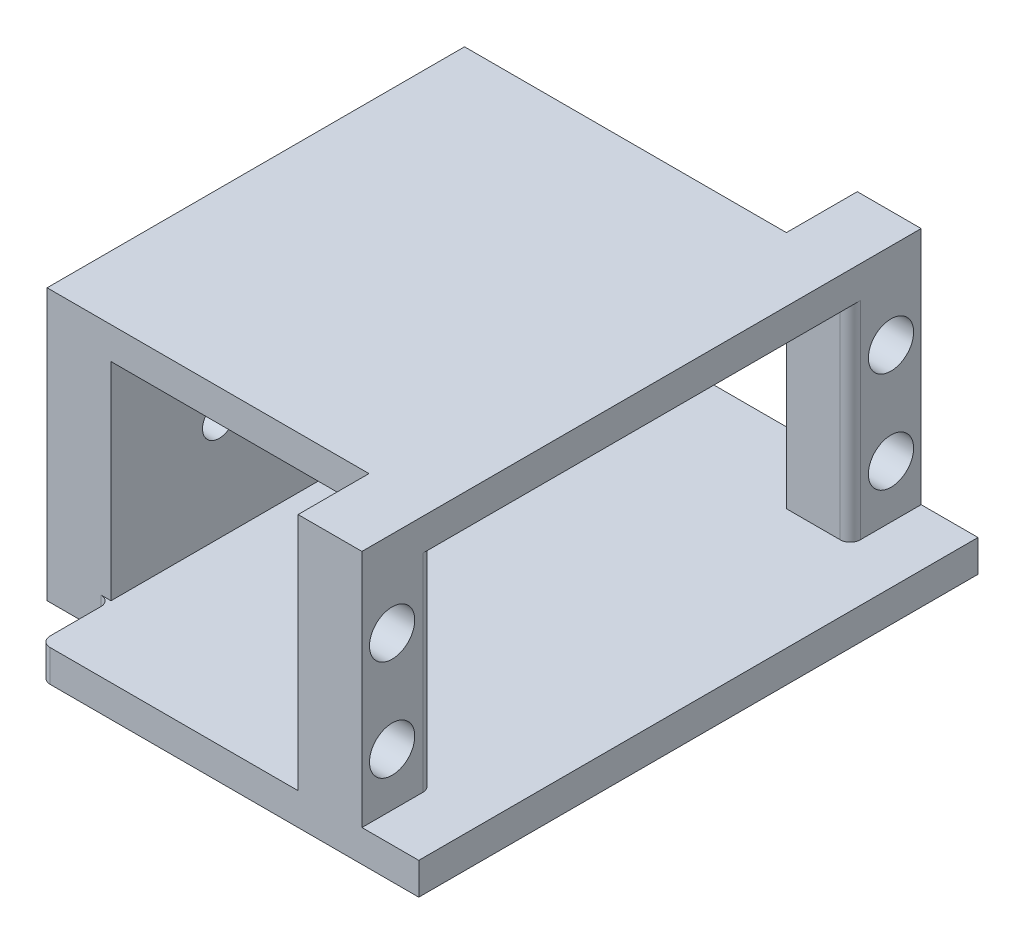
ISO-10303-21;
HEADER;
FILE_DESCRIPTION(('STEP AP214'),'2;1');
FILE_NAME('part.step','',(''),(''),'','','');
FILE_SCHEMA(('AUTOMOTIVE_DESIGN { 1 0 10303 214 1 1 1 1 }'));
ENDSEC;
DATA;
#1=APPLICATION_CONTEXT('core data for automotive mechanical design processes');
#2=APPLICATION_PROTOCOL_DEFINITION('international standard','automotive_design',2000,#1);
#3=PRODUCT_CONTEXT('',#1,'mechanical');
#4=PRODUCT('Part','Part','',(#3));
#5=PRODUCT_RELATED_PRODUCT_CATEGORY('part','',(#4));
#6=PRODUCT_DEFINITION_FORMATION('','',#4);
#7=PRODUCT_DEFINITION_CONTEXT('part definition',#1,'design');
#8=PRODUCT_DEFINITION('design','',#6,#7);
#9=PRODUCT_DEFINITION_SHAPE('','',#8);
#10=(LENGTH_UNIT() NAMED_UNIT(*) SI_UNIT(.MILLI.,.METRE.));
#11=(NAMED_UNIT(*) PLANE_ANGLE_UNIT() SI_UNIT($,.RADIAN.));
#12=(NAMED_UNIT(*) SI_UNIT($,.STERADIAN.) SOLID_ANGLE_UNIT());
#13=UNCERTAINTY_MEASURE_WITH_UNIT(LENGTH_MEASURE(1.E-05),#10,'distance_accuracy_value','');
#14=(GEOMETRIC_REPRESENTATION_CONTEXT(3) GLOBAL_UNCERTAINTY_ASSIGNED_CONTEXT((#13)) GLOBAL_UNIT_ASSIGNED_CONTEXT((#10,
#11,#12)) REPRESENTATION_CONTEXT('',''));
#15=CARTESIAN_POINT('',(0.,0.,0.));
#16=DIRECTION('',(0.,0.,1.));
#17=DIRECTION('',(1.,0.,0.));
#18=AXIS2_PLACEMENT_3D('',#15,#16,#17);
#19=CARTESIAN_POINT('',(0.,3.175,0.));
#20=DIRECTION('',(0.,1.,0.));
#21=DIRECTION('',(0.,0.,1.));
#22=AXIS2_PLACEMENT_3D('',#19,#20,#21);
#23=PLANE('',#22);
#24=DIRECTION('',(0.,0.,-1.));
#25=VECTOR('',#24,1.);
#26=CARTESIAN_POINT('',(-15.65,3.175,27.8));
#27=LINE('',#26,#25);
#28=CARTESIAN_POINT('',(-15.65,3.175,26.8));
#29=VERTEX_POINT('',#28);
#30=CARTESIAN_POINT('',(-15.65,3.175,21.7499999999998));
#31=VERTEX_POINT('',#30);
#32=EDGE_CURVE('E300',#29,#31,#27,.T.);
#33=ORIENTED_EDGE('',*,*,#32,.F.);
#34=CARTESIAN_POINT('',(-14.65,3.175,26.8));
#35=DIRECTION('',(0.,1.,0.));
#36=DIRECTION('',(0.,0.,1.));
#37=AXIS2_PLACEMENT_3D('',#34,#35,#36);
#38=CIRCLE('',#37,1.);
#39=CARTESIAN_POINT('',(-14.65,3.175,27.8));
#40=VERTEX_POINT('',#39);
#41=EDGE_CURVE('E272',#29,#40,#38,.T.);
#42=ORIENTED_EDGE('',*,*,#41,.T.);
#43=DIRECTION('',(1.,0.,0.));
#44=VECTOR('',#43,1.);
#45=CARTESIAN_POINT('',(-22.,3.175,27.8));
#46=LINE('',#45,#44);
#47=CARTESIAN_POINT('',(9.99999999999993,3.175,27.8));
#48=VERTEX_POINT('',#47);
#49=EDGE_CURVE('E242',#40,#48,#46,.T.);
#50=ORIENTED_EDGE('',*,*,#49,.T.);
#51=DIRECTION('',(0.,0.,1.));
#52=VECTOR('',#51,1.);
#53=CARTESIAN_POINT('',(9.99999999999993,3.175,27.8));
#54=LINE('',#53,#52);
#55=CARTESIAN_POINT('',(9.99999999999993,3.175,20.75));
#56=VERTEX_POINT('',#55);
#57=EDGE_CURVE('E454',#56,#48,#54,.T.);
#58=ORIENTED_EDGE('',*,*,#57,.F.);
#59=DIRECTION('',(-1.,0.,0.));
#60=VECTOR('',#59,1.);
#61=CARTESIAN_POINT('',(16.3499999999999,3.175,20.75));
#62=LINE('',#61,#60);
#63=CARTESIAN_POINT('',(15.3499999999999,3.175,20.75));
#64=VERTEX_POINT('',#63);
#65=EDGE_CURVE('E456',#64,#56,#62,.T.);
#66=ORIENTED_EDGE('',*,*,#65,.F.);
#67=CARTESIAN_POINT('',(15.3499999999999,3.175,21.75));
#68=DIRECTION('',(0.,1.,0.));
#69=DIRECTION('',(0.,0.,1.));
#70=AXIS2_PLACEMENT_3D('',#67,#68,#69);
#71=CIRCLE('',#70,1.);
#72=CARTESIAN_POINT('',(16.3499999999999,3.175,21.75));
#73=VERTEX_POINT('',#72);
#74=EDGE_CURVE('E261',#64,#73,#71,.F.);
#75=ORIENTED_EDGE('',*,*,#74,.T.);
#76=DIRECTION('',(0.,0.,-1.));
#77=VECTOR('',#76,1.);
#78=CARTESIAN_POINT('',(16.3499999999999,3.175,27.8));
#79=LINE('',#78,#77);
#80=CARTESIAN_POINT('',(16.3499999999999,3.175,27.8));
#81=VERTEX_POINT('',#80);
#82=EDGE_CURVE('E353',#81,#73,#79,.T.);
#83=ORIENTED_EDGE('',*,*,#82,.F.);
#84=CARTESIAN_POINT('',(22.,3.175,27.8));
#85=VERTEX_POINT('',#84);
#86=EDGE_CURVE('E333',#81,#85,#46,.T.);
#87=ORIENTED_EDGE('',*,*,#86,.T.);
#88=DIRECTION('',(0.,0.,-1.));
#89=VECTOR('',#88,1.);
#90=CARTESIAN_POINT('',(22.,3.175,-27.8));
#91=LINE('',#90,#89);
#92=CARTESIAN_POINT('',(22.,3.175,-27.8));
#93=VERTEX_POINT('',#92);
#94=EDGE_CURVE('E232',#85,#93,#91,.T.);
#95=ORIENTED_EDGE('',*,*,#94,.T.);
#96=DIRECTION('',(-1.,0.,0.));
#97=VECTOR('',#96,1.);
#98=CARTESIAN_POINT('',(-22.,3.175,-27.8));
#99=LINE('',#98,#97);
#100=CARTESIAN_POINT('',(16.3499999999999,3.175,-27.8));
#101=VERTEX_POINT('',#100);
#102=EDGE_CURVE('E330',#93,#101,#99,.T.);
#103=ORIENTED_EDGE('',*,*,#102,.T.);
#104=DIRECTION('',(0.,0.,-1.));
#105=VECTOR('',#104,1.);
#106=CARTESIAN_POINT('',(16.3499999999999,3.175,-27.8000000000005));
#107=LINE('',#106,#105);
#108=CARTESIAN_POINT('',(16.3499999999999,3.175,-21.7500000000005));
#109=VERTEX_POINT('',#108);
#110=EDGE_CURVE('E437',#109,#101,#107,.T.);
#111=ORIENTED_EDGE('',*,*,#110,.F.);
#112=CARTESIAN_POINT('',(15.3499999999999,3.175,-21.7500000000005));
#113=DIRECTION('',(0.,1.,0.));
#114=DIRECTION('',(0.,0.,1.));
#115=AXIS2_PLACEMENT_3D('',#112,#113,#114);
#116=CIRCLE('',#115,1.);
#117=CARTESIAN_POINT('',(15.3499999999999,3.175,-20.7500000000005));
#118=VERTEX_POINT('',#117);
#119=EDGE_CURVE('E256',#109,#118,#116,.F.);
#120=ORIENTED_EDGE('',*,*,#119,.T.);
#121=DIRECTION('',(1.,0.,0.));
#122=VECTOR('',#121,1.);
#123=CARTESIAN_POINT('',(16.3499999999999,3.175,-20.7500000000005));
#124=LINE('',#123,#122);
#125=CARTESIAN_POINT('',(9.99999999999991,3.175,-20.7500000000005));
#126=VERTEX_POINT('',#125);
#127=EDGE_CURVE('E440',#126,#118,#124,.T.);
#128=ORIENTED_EDGE('',*,*,#127,.F.);
#129=DIRECTION('',(0.,0.,1.));
#130=VECTOR('',#129,1.);
#131=CARTESIAN_POINT('',(9.99999999999991,3.175,-27.8000000000005));
#132=LINE('',#131,#130);
#133=CARTESIAN_POINT('',(9.99999999999991,3.175,-27.8000000000005));
#134=VERTEX_POINT('',#133);
#135=EDGE_CURVE('E433',#134,#126,#132,.T.);
#136=ORIENTED_EDGE('',*,*,#135,.F.);
#137=CARTESIAN_POINT('',(-14.65,3.175,-27.8));
#138=VERTEX_POINT('',#137);
#139=EDGE_CURVE('E329',#134,#138,#99,.T.);
#140=ORIENTED_EDGE('',*,*,#139,.T.);
#141=CARTESIAN_POINT('',(-14.65,3.175,-26.8));
#142=DIRECTION('',(0.,1.,0.));
#143=DIRECTION('',(0.,0.,1.));
#144=AXIS2_PLACEMENT_3D('',#141,#142,#143);
#145=CIRCLE('',#144,1.);
#146=CARTESIAN_POINT('',(-15.65,3.175,-26.8));
#147=VERTEX_POINT('',#146);
#148=EDGE_CURVE('E270',#138,#147,#145,.T.);
#149=ORIENTED_EDGE('',*,*,#148,.T.);
#150=DIRECTION('',(0.,0.,-1.));
#151=VECTOR('',#150,1.);
#152=CARTESIAN_POINT('',(-15.65,3.175,-27.8));
#153=LINE('',#152,#151);
#154=CARTESIAN_POINT('',(-15.65,3.175,-21.7500000000003));
#155=VERTEX_POINT('',#154);
#156=EDGE_CURVE('E367',#155,#147,#153,.T.);
#157=ORIENTED_EDGE('',*,*,#156,.F.);
#158=CARTESIAN_POINT('',(-16.65,3.175,-21.7500000000003));
#159=DIRECTION('',(0.,1.,0.));
#160=DIRECTION('',(0.,0.,1.));
#161=AXIS2_PLACEMENT_3D('',#158,#159,#160);
#162=CIRCLE('',#161,1.);
#163=CARTESIAN_POINT('',(-16.65,3.175,-20.7500000000003));
#164=VERTEX_POINT('',#163);
#165=EDGE_CURVE('E43',#155,#164,#162,.F.);
#166=ORIENTED_EDGE('',*,*,#165,.T.);
#167=DIRECTION('',(-1.,0.,0.));
#168=VECTOR('',#167,1.);
#169=CARTESIAN_POINT('',(-15.65,3.175,-20.7500000000003));
#170=LINE('',#169,#168);
#171=CARTESIAN_POINT('',(-15.65,3.175,-20.7500000000003));
#172=VERTEX_POINT('',#171);
#173=EDGE_CURVE('E50',#172,#164,#170,.T.);
#174=ORIENTED_EDGE('',*,*,#173,.F.);
#175=DIRECTION('',(0.,0.,-1.));
#176=VECTOR('',#175,1.);
#177=CARTESIAN_POINT('',(-15.65,3.175,-20.7500000000003));
#178=LINE('',#177,#176);
#179=CARTESIAN_POINT('',(-15.65,3.175,20.7499999999998));
#180=VERTEX_POINT('',#179);
#181=EDGE_CURVE('E314',#180,#172,#178,.T.);
#182=ORIENTED_EDGE('',*,*,#181,.F.);
#183=DIRECTION('',(1.,0.,0.));
#184=VECTOR('',#183,1.);
#185=CARTESIAN_POINT('',(-15.65,3.175,20.7499999999998));
#186=LINE('',#185,#184);
#187=CARTESIAN_POINT('',(-16.65,3.175,20.7499999999998));
#188=VERTEX_POINT('',#187);
#189=EDGE_CURVE('E280',#188,#180,#186,.T.);
#190=ORIENTED_EDGE('',*,*,#189,.F.);
#191=CARTESIAN_POINT('',(-16.65,3.175,21.7499999999998));
#192=DIRECTION('',(0.,1.,0.));
#193=DIRECTION('',(0.,0.,1.));
#194=AXIS2_PLACEMENT_3D('',#191,#192,#193);
#195=CIRCLE('',#194,1.);
#196=EDGE_CURVE('E295',#188,#31,#195,.F.);
#197=ORIENTED_EDGE('',*,*,#196,.T.);
#198=EDGE_LOOP('',(#33,#42,#50,#58,#66,#75,#83,#87,#95,#103,#111,#120,#128,#136,#140,#149,#157,
#166,#174,#182,#190,#197));
#199=FACE_BOUND('',#198,.T.);
#200=ADVANCED_FACE('F35',(#199),#23,.T.);
#201=CARTESIAN_POINT('',(22.,3.175,-27.8));
#202=DIRECTION('',(-1.,0.,0.));
#203=DIRECTION('',(0.,0.,1.));
#204=AXIS2_PLACEMENT_3D('',#201,#202,#203);
#205=PLANE('',#204);
#206=DIRECTION('',(0.,0.,-1.));
#207=VECTOR('',#206,1.);
#208=CARTESIAN_POINT('',(22.,0.,-27.8));
#209=LINE('',#208,#207);
#210=CARTESIAN_POINT('',(22.,0.,27.8));
#211=VERTEX_POINT('',#210);
#212=CARTESIAN_POINT('',(22.,0.,-27.8));
#213=VERTEX_POINT('',#212);
#214=EDGE_CURVE('E211',#211,#213,#209,.T.);
#215=ORIENTED_EDGE('',*,*,#214,.T.);
#216=DIRECTION('',(0.,-1.,0.));
#217=VECTOR('',#216,1.);
#218=CARTESIAN_POINT('',(22.,3.175,-27.8));
#219=LINE('',#218,#217);
#220=EDGE_CURVE('E241',#93,#213,#219,.T.);
#221=ORIENTED_EDGE('',*,*,#220,.F.);
#222=ORIENTED_EDGE('',*,*,#94,.F.);
#223=DIRECTION('',(0.,-1.,0.));
#224=VECTOR('',#223,1.);
#225=CARTESIAN_POINT('',(22.,3.175,27.8));
#226=LINE('',#225,#224);
#227=EDGE_CURVE('E238',#85,#211,#226,.T.);
#228=ORIENTED_EDGE('',*,*,#227,.T.);
#229=EDGE_LOOP('',(#215,#221,#222,#228));
#230=FACE_BOUND('',#229,.T.);
#231=ADVANCED_FACE('F338',(#230),#205,.F.);
#232=CARTESIAN_POINT('',(-22.,3.175,-27.8));
#233=DIRECTION('',(0.,0.,1.));
#234=DIRECTION('',(1.,0.,0.));
#235=AXIS2_PLACEMENT_3D('',#232,#233,#234);
#236=PLANE('',#235);
#237=DIRECTION('',(-1.,0.,0.));
#238=VECTOR('',#237,1.);
#239=CARTESIAN_POINT('',(-22.,0.,-27.8));
#240=LINE('',#239,#238);
#241=CARTESIAN_POINT('',(-14.65,0.,-27.8));
#242=VERTEX_POINT('',#241);
#243=EDGE_CURVE('E230',#213,#242,#240,.T.);
#244=ORIENTED_EDGE('',*,*,#243,.T.);
#245=DIRECTION('',(0.,1.,0.));
#246=VECTOR('',#245,1.);
#247=CARTESIAN_POINT('',(-14.65,3.175,-27.8));
#248=LINE('',#247,#246);
#249=EDGE_CURVE('E292',#242,#138,#248,.T.);
#250=ORIENTED_EDGE('',*,*,#249,.T.);
#251=ORIENTED_EDGE('',*,*,#139,.F.);
#252=DIRECTION('',(0.,-1.,0.));
#253=VECTOR('',#252,1.);
#254=CARTESIAN_POINT('',(9.99999999999991,23.775,-27.8000000000005));
#255=LINE('',#254,#253);
#256=CARTESIAN_POINT('',(9.99999999999991,26.95,-27.8000000000005));
#257=VERTEX_POINT('',#256);
#258=EDGE_CURVE('E448',#257,#134,#255,.T.);
#259=ORIENTED_EDGE('',*,*,#258,.F.);
#260=DIRECTION('',(-1.,0.,0.));
#261=VECTOR('',#260,1.);
#262=CARTESIAN_POINT('',(9.99999999999991,26.95,-27.8000000000005));
#263=LINE('',#262,#261);
#264=CARTESIAN_POINT('',(16.3499999999999,26.95,-27.8000000000005));
#265=VERTEX_POINT('',#264);
#266=EDGE_CURVE('E414',#265,#257,#263,.T.);
#267=ORIENTED_EDGE('',*,*,#266,.F.);
#268=DIRECTION('',(0.,-1.,0.));
#269=VECTOR('',#268,1.);
#270=CARTESIAN_POINT('',(16.3499999999999,23.775,-27.8000000000005));
#271=LINE('',#270,#269);
#272=EDGE_CURVE('E349',#265,#101,#271,.T.);
#273=ORIENTED_EDGE('',*,*,#272,.T.);
#274=ORIENTED_EDGE('',*,*,#102,.F.);
#275=ORIENTED_EDGE('',*,*,#220,.T.);
#276=EDGE_LOOP('',(#244,#250,#251,#259,#267,#273,#274,#275));
#277=FACE_BOUND('',#276,.T.);
#278=ADVANCED_FACE('F346',(#277),#236,.F.);
#279=CARTESIAN_POINT('',(-22.,3.175,-27.8));
#280=DIRECTION('',(1.,0.,0.));
#281=DIRECTION('',(0.,0.,-1.));
#282=AXIS2_PLACEMENT_3D('',#279,#280,#281);
#283=PLANE('',#282);
#284=CARTESIAN_POINT('',(-22.,13.43,9.99999999999983));
#285=DIRECTION('',(-1.,0.,0.));
#286=DIRECTION('',(0.,0.,1.));
#287=AXIS2_PLACEMENT_3D('',#284,#285,#286);
#288=CIRCLE('',#287,1.65);
#289=CARTESIAN_POINT('',(-22.,13.43,11.6499999999998));
#290=VERTEX_POINT('',#289);
#291=EDGE_CURVE('E223',#290,#290,#288,.T.);
#292=ORIENTED_EDGE('',*,*,#291,.F.);
#293=EDGE_LOOP('',(#292));
#294=FACE_BOUND('',#293,.T.);
#295=DIRECTION('',(0.,0.,1.));
#296=VECTOR('',#295,1.);
#297=CARTESIAN_POINT('',(-22.,0.,-27.8));
#298=LINE('',#297,#296);
#299=CARTESIAN_POINT('',(-22.,0.,-20.7500000000003));
#300=VERTEX_POINT('',#299);
#301=CARTESIAN_POINT('',(-22.,0.,20.7499999999998));
#302=VERTEX_POINT('',#301);
#303=EDGE_CURVE('E219',#300,#302,#298,.T.);
#304=ORIENTED_EDGE('',*,*,#303,.T.);
#305=DIRECTION('',(0.,-1.,0.));
#306=VECTOR('',#305,1.);
#307=CARTESIAN_POINT('',(-22.,23.775,20.7499999999998));
#308=LINE('',#307,#306);
#309=CARTESIAN_POINT('',(-22.,26.95,20.7499999999998));
#310=VERTEX_POINT('',#309);
#311=EDGE_CURVE('E199',#310,#302,#308,.T.);
#312=ORIENTED_EDGE('',*,*,#311,.F.);
#313=DIRECTION('',(0.,0.,1.));
#314=VECTOR('',#313,1.);
#315=CARTESIAN_POINT('',(-22.,26.95,20.7499999999998));
#316=LINE('',#315,#314);
#317=CARTESIAN_POINT('',(-22.,26.95,-20.7500000000003));
#318=VERTEX_POINT('',#317);
#319=EDGE_CURVE('E401',#318,#310,#316,.T.);
#320=ORIENTED_EDGE('',*,*,#319,.F.);
#321=DIRECTION('',(0.,-1.,0.));
#322=VECTOR('',#321,1.);
#323=CARTESIAN_POINT('',(-22.,23.775,-20.7500000000003));
#324=LINE('',#323,#322);
#325=EDGE_CURVE('E228',#318,#300,#324,.T.);
#326=ORIENTED_EDGE('',*,*,#325,.T.);
#327=EDGE_LOOP('',(#304,#312,#320,#326));
#328=FACE_BOUND('',#327,.T.);
#329=ADVANCED_FACE('F227',(#294,#328),#283,.F.);
#330=CARTESIAN_POINT('',(-22.,3.175,27.8));
#331=DIRECTION('',(0.,0.,-1.));
#332=DIRECTION('',(-1.,0.,0.));
#333=AXIS2_PLACEMENT_3D('',#330,#331,#332);
#334=PLANE('',#333);
#335=ORIENTED_EDGE('',*,*,#49,.F.);
#336=DIRECTION('',(0.,1.,0.));
#337=VECTOR('',#336,1.);
#338=CARTESIAN_POINT('',(-14.65,3.175,27.8));
#339=LINE('',#338,#337);
#340=CARTESIAN_POINT('',(-14.65,0.,27.8));
#341=VERTEX_POINT('',#340);
#342=EDGE_CURVE('E274',#40,#341,#339,.F.);
#343=ORIENTED_EDGE('',*,*,#342,.T.);
#344=DIRECTION('',(1.,0.,0.));
#345=VECTOR('',#344,1.);
#346=CARTESIAN_POINT('',(-22.,0.,27.8));
#347=LINE('',#346,#345);
#348=EDGE_CURVE('E229',#341,#211,#347,.T.);
#349=ORIENTED_EDGE('',*,*,#348,.T.);
#350=ORIENTED_EDGE('',*,*,#227,.F.);
#351=ORIENTED_EDGE('',*,*,#86,.F.);
#352=DIRECTION('',(0.,-1.,0.));
#353=VECTOR('',#352,1.);
#354=CARTESIAN_POINT('',(16.3499999999999,23.775,27.8));
#355=LINE('',#354,#353);
#356=CARTESIAN_POINT('',(16.3499999999999,26.95,27.8));
#357=VERTEX_POINT('',#356);
#358=EDGE_CURVE('E453',#357,#81,#355,.T.);
#359=ORIENTED_EDGE('',*,*,#358,.F.);
#360=DIRECTION('',(1.,0.,0.));
#361=VECTOR('',#360,1.);
#362=CARTESIAN_POINT('',(16.3499999999999,26.95,27.8));
#363=LINE('',#362,#361);
#364=CARTESIAN_POINT('',(9.99999999999993,26.95,27.8));
#365=VERTEX_POINT('',#364);
#366=EDGE_CURVE('E408',#365,#357,#363,.T.);
#367=ORIENTED_EDGE('',*,*,#366,.F.);
#368=DIRECTION('',(0.,-1.,0.));
#369=VECTOR('',#368,1.);
#370=CARTESIAN_POINT('',(9.99999999999993,23.775,27.8));
#371=LINE('',#370,#369);
#372=EDGE_CURVE('E461',#365,#48,#371,.T.);
#373=ORIENTED_EDGE('',*,*,#372,.T.);
#374=EDGE_LOOP('',(#335,#343,#349,#350,#351,#359,#367,#373));
#375=FACE_BOUND('',#374,.T.);
#376=ADVANCED_FACE('F357',(#375),#334,.F.);
#377=CARTESIAN_POINT('',(0.,0.,0.));
#378=DIRECTION('',(0.,1.,0.));
#379=DIRECTION('',(0.,0.,1.));
#380=AXIS2_PLACEMENT_3D('',#377,#378,#379);
#381=PLANE('',#380);
#382=ORIENTED_EDGE('',*,*,#348,.F.);
#383=CARTESIAN_POINT('',(-14.65,0.,26.8));
#384=DIRECTION('',(0.,1.,0.));
#385=DIRECTION('',(0.,0.,1.));
#386=AXIS2_PLACEMENT_3D('',#383,#384,#385);
#387=CIRCLE('',#386,1.);
#388=CARTESIAN_POINT('',(-15.65,0.,26.8));
#389=VERTEX_POINT('',#388);
#390=EDGE_CURVE('E278',#341,#389,#387,.F.);
#391=ORIENTED_EDGE('',*,*,#390,.T.);
#392=DIRECTION('',(0.,0.,1.));
#393=VECTOR('',#392,1.);
#394=CARTESIAN_POINT('',(-15.65,0.,27.8));
#395=LINE('',#394,#393);
#396=CARTESIAN_POINT('',(-15.65,0.,21.7499999999998));
#397=VERTEX_POINT('',#396);
#398=EDGE_CURVE('E224',#397,#389,#395,.T.);
#399=ORIENTED_EDGE('',*,*,#398,.F.);
#400=CARTESIAN_POINT('',(-16.65,0.,21.7499999999998));
#401=DIRECTION('',(0.,1.,0.));
#402=DIRECTION('',(0.,0.,1.));
#403=AXIS2_PLACEMENT_3D('',#400,#401,#402);
#404=CIRCLE('',#403,1.);
#405=CARTESIAN_POINT('',(-16.65,0.,20.7499999999998));
#406=VERTEX_POINT('',#405);
#407=EDGE_CURVE('E222',#397,#406,#404,.T.);
#408=ORIENTED_EDGE('',*,*,#407,.T.);
#409=DIRECTION('',(1.,0.,0.));
#410=VECTOR('',#409,1.);
#411=CARTESIAN_POINT('',(-22.,0.,20.7499999999998));
#412=LINE('',#411,#410);
#413=EDGE_CURVE('E203',#302,#406,#412,.T.);
#414=ORIENTED_EDGE('',*,*,#413,.F.);
#415=ORIENTED_EDGE('',*,*,#303,.F.);
#416=DIRECTION('',(-1.,0.,0.));
#417=VECTOR('',#416,1.);
#418=CARTESIAN_POINT('',(-22.,0.,-20.7500000000003));
#419=LINE('',#418,#417);
#420=CARTESIAN_POINT('',(-16.65,0.,-20.7500000000003));
#421=VERTEX_POINT('',#420);
#422=EDGE_CURVE('E307',#421,#300,#419,.T.);
#423=ORIENTED_EDGE('',*,*,#422,.F.);
#424=CARTESIAN_POINT('',(-16.65,0.,-21.7500000000003));
#425=DIRECTION('',(0.,1.,0.));
#426=DIRECTION('',(0.,0.,1.));
#427=AXIS2_PLACEMENT_3D('',#424,#425,#426);
#428=CIRCLE('',#427,1.);
#429=CARTESIAN_POINT('',(-15.65,0.,-21.7500000000003));
#430=VERTEX_POINT('',#429);
#431=EDGE_CURVE('E11',#421,#430,#428,.T.);
#432=ORIENTED_EDGE('',*,*,#431,.T.);
#433=DIRECTION('',(0.,0.,1.));
#434=VECTOR('',#433,1.);
#435=CARTESIAN_POINT('',(-15.65,0.,-27.8));
#436=LINE('',#435,#434);
#437=CARTESIAN_POINT('',(-15.65,0.,-26.8));
#438=VERTEX_POINT('',#437);
#439=EDGE_CURVE('E364',#438,#430,#436,.T.);
#440=ORIENTED_EDGE('',*,*,#439,.F.);
#441=CARTESIAN_POINT('',(-14.65,0.,-26.8));
#442=DIRECTION('',(0.,1.,0.));
#443=DIRECTION('',(0.,0.,1.));
#444=AXIS2_PLACEMENT_3D('',#441,#442,#443);
#445=CIRCLE('',#444,1.);
#446=EDGE_CURVE('E276',#438,#242,#445,.F.);
#447=ORIENTED_EDGE('',*,*,#446,.T.);
#448=ORIENTED_EDGE('',*,*,#243,.F.);
#449=ORIENTED_EDGE('',*,*,#214,.F.);
#450=EDGE_LOOP('',(#382,#391,#399,#408,#414,#415,#423,#432,#440,#447,#448,#449));
#451=FACE_BOUND('',#450,.T.);
#452=ADVANCED_FACE('F217',(#451),#381,.F.);
#453=CARTESIAN_POINT('',(-15.65,23.775,20.7499999999998));
#454=DIRECTION('',(0.,0.,-1.));
#455=DIRECTION('',(-1.,0.,0.));
#456=AXIS2_PLACEMENT_3D('',#453,#454,#455);
#457=PLANE('',#456);
#458=ORIENTED_EDGE('',*,*,#413,.T.);
#459=DIRECTION('',(0.,1.,0.));
#460=VECTOR('',#459,1.);
#461=CARTESIAN_POINT('',(-16.65,3.175,20.7499999999998));
#462=LINE('',#461,#460);
#463=EDGE_CURVE('E282',#406,#188,#462,.T.);
#464=ORIENTED_EDGE('',*,*,#463,.T.);
#465=ORIENTED_EDGE('',*,*,#189,.T.);
#466=DIRECTION('',(0.,-1.,0.));
#467=VECTOR('',#466,1.);
#468=CARTESIAN_POINT('',(-15.65,23.775,20.7499999999998));
#469=LINE('',#468,#467);
#470=CARTESIAN_POINT('',(-15.65,23.775,20.7499999999998));
#471=VERTEX_POINT('',#470);
#472=EDGE_CURVE('E212',#471,#180,#469,.T.);
#473=ORIENTED_EDGE('',*,*,#472,.F.);
#474=DIRECTION('',(1.,0.,0.));
#475=VECTOR('',#474,1.);
#476=CARTESIAN_POINT('',(9.99999999999993,23.775,20.75));
#477=LINE('',#476,#475);
#478=CARTESIAN_POINT('',(9.99999999999993,23.775,20.75));
#479=VERTEX_POINT('',#478);
#480=EDGE_CURVE('E400',#471,#479,#477,.T.);
#481=ORIENTED_EDGE('',*,*,#480,.T.);
#482=DIRECTION('',(0.,-1.,0.));
#483=VECTOR('',#482,1.);
#484=CARTESIAN_POINT('',(9.99999999999993,26.95,20.75));
#485=LINE('',#484,#483);
#486=CARTESIAN_POINT('',(9.99999999999993,26.95,20.75));
#487=VERTEX_POINT('',#486);
#488=EDGE_CURVE('E430',#487,#479,#485,.T.);
#489=ORIENTED_EDGE('',*,*,#488,.F.);
#490=DIRECTION('',(1.,0.,0.));
#491=VECTOR('',#490,1.);
#492=CARTESIAN_POINT('',(9.99999999999993,26.95,20.75));
#493=LINE('',#492,#491);
#494=EDGE_CURVE('E206',#310,#487,#493,.T.);
#495=ORIENTED_EDGE('',*,*,#494,.F.);
#496=ORIENTED_EDGE('',*,*,#311,.T.);
#497=EDGE_LOOP('',(#458,#464,#465,#473,#481,#489,#495,#496));
#498=FACE_BOUND('',#497,.T.);
#499=ADVANCED_FACE('F201',(#498),#457,.F.);
#500=CARTESIAN_POINT('',(-15.65,23.775,-20.7500000000003));
#501=DIRECTION('',(-1.,0.,0.));
#502=DIRECTION('',(0.,0.,1.));
#503=AXIS2_PLACEMENT_3D('',#500,#501,#502);
#504=PLANE('',#503);
#505=CARTESIAN_POINT('',(-15.65,13.43,9.99999999999983));
#506=DIRECTION('',(-1.,0.,0.));
#507=DIRECTION('',(0.,0.,1.));
#508=AXIS2_PLACEMENT_3D('',#505,#506,#507);
#509=CIRCLE('',#508,1.65);
#510=CARTESIAN_POINT('',(-15.65,13.43,11.6499999999998));
#511=VERTEX_POINT('',#510);
#512=EDGE_CURVE('E373',#511,#511,#509,.F.);
#513=ORIENTED_EDGE('',*,*,#512,.F.);
#514=EDGE_LOOP('',(#513));
#515=FACE_BOUND('',#514,.T.);
#516=ORIENTED_EDGE('',*,*,#181,.T.);
#517=DIRECTION('',(0.,-1.,0.));
#518=VECTOR('',#517,1.);
#519=CARTESIAN_POINT('',(-15.65,23.775,-20.7500000000003));
#520=LINE('',#519,#518);
#521=CARTESIAN_POINT('',(-15.65,23.775,-20.7500000000003));
#522=VERTEX_POINT('',#521);
#523=EDGE_CURVE('E322',#522,#172,#520,.T.);
#524=ORIENTED_EDGE('',*,*,#523,.F.);
#525=DIRECTION('',(0.,0.,-1.));
#526=VECTOR('',#525,1.);
#527=CARTESIAN_POINT('',(-15.65,23.775,-20.7500000000003));
#528=LINE('',#527,#526);
#529=EDGE_CURVE('E316',#471,#522,#528,.T.);
#530=ORIENTED_EDGE('',*,*,#529,.F.);
#531=ORIENTED_EDGE('',*,*,#472,.T.);
#532=EDGE_LOOP('',(#516,#524,#530,#531));
#533=FACE_BOUND('',#532,.T.);
#534=ADVANCED_FACE('F319',(#515,#533),#504,.F.);
#535=CARTESIAN_POINT('',(-15.65,23.775,-20.7500000000003));
#536=DIRECTION('',(0.,0.,1.));
#537=DIRECTION('',(1.,0.,0.));
#538=AXIS2_PLACEMENT_3D('',#535,#536,#537);
#539=PLANE('',#538);
#540=ORIENTED_EDGE('',*,*,#523,.T.);
#541=ORIENTED_EDGE('',*,*,#173,.T.);
#542=DIRECTION('',(0.,1.,0.));
#543=VECTOR('',#542,1.);
#544=CARTESIAN_POINT('',(-16.65,0.,-20.7500000000003));
#545=LINE('',#544,#543);
#546=EDGE_CURVE('E289',#164,#421,#545,.F.);
#547=ORIENTED_EDGE('',*,*,#546,.T.);
#548=ORIENTED_EDGE('',*,*,#422,.T.);
#549=ORIENTED_EDGE('',*,*,#325,.F.);
#550=DIRECTION('',(-1.,0.,0.));
#551=VECTOR('',#550,1.);
#552=CARTESIAN_POINT('',(-22.,26.95,-20.7500000000003));
#553=LINE('',#552,#551);
#554=CARTESIAN_POINT('',(9.99999999999991,26.95,-20.7500000000005));
#555=VERTEX_POINT('',#554);
#556=EDGE_CURVE('E419',#555,#318,#553,.T.);
#557=ORIENTED_EDGE('',*,*,#556,.F.);
#558=DIRECTION('',(0.,-1.,0.));
#559=VECTOR('',#558,1.);
#560=CARTESIAN_POINT('',(9.99999999999991,26.95,-20.7500000000005));
#561=LINE('',#560,#559);
#562=CARTESIAN_POINT('',(9.99999999999991,23.775,-20.7500000000005));
#563=VERTEX_POINT('',#562);
#564=EDGE_CURVE('E422',#555,#563,#561,.T.);
#565=ORIENTED_EDGE('',*,*,#564,.T.);
#566=DIRECTION('',(-1.,0.,0.));
#567=VECTOR('',#566,1.);
#568=CARTESIAN_POINT('',(-22.,23.775,-20.7500000000003));
#569=LINE('',#568,#567);
#570=EDGE_CURVE('E403',#563,#522,#569,.T.);
#571=ORIENTED_EDGE('',*,*,#570,.T.);
#572=EDGE_LOOP('',(#540,#541,#547,#548,#549,#557,#565,#571));
#573=FACE_BOUND('',#572,.T.);
#574=ADVANCED_FACE('F469',(#573),#539,.F.);
#575=CARTESIAN_POINT('',(16.3499999999999,23.775,27.8));
#576=DIRECTION('',(-1.,0.,0.));
#577=DIRECTION('',(0.,0.,1.));
#578=AXIS2_PLACEMENT_3D('',#575,#576,#577);
#579=PLANE('',#578);
#580=CARTESIAN_POINT('',(16.3499999999999,8.42499999999954,-24.8000000000002));
#581=DIRECTION('',(1.,0.,0.));
#582=DIRECTION('',(0.,0.,1.));
#583=AXIS2_PLACEMENT_3D('',#580,#581,#582);
#584=CIRCLE('',#583,2.25);
#585=CARTESIAN_POINT('',(16.3499999999999,8.42499999999954,-22.5500000000001));
#586=VERTEX_POINT('',#585);
#587=EDGE_CURVE('E376',#586,#586,#584,.T.);
#588=ORIENTED_EDGE('',*,*,#587,.F.);
#589=EDGE_LOOP('',(#588));
#590=FACE_BOUND('',#589,.T.);
#591=CARTESIAN_POINT('',(16.3499999999999,18.4249999999995,-24.8000000000003));
#592=DIRECTION('',(1.,0.,0.));
#593=DIRECTION('',(0.,0.,1.));
#594=AXIS2_PLACEMENT_3D('',#591,#592,#593);
#595=CIRCLE('',#594,2.25);
#596=CARTESIAN_POINT('',(16.3499999999999,18.4249999999995,-22.5500000000003));
#597=VERTEX_POINT('',#596);
#598=EDGE_CURVE('E385',#597,#597,#595,.T.);
#599=ORIENTED_EDGE('',*,*,#598,.F.);
#600=EDGE_LOOP('',(#599));
#601=FACE_BOUND('',#600,.T.);
#602=CARTESIAN_POINT('',(16.3499999999999,18.425,24.8));
#603=DIRECTION('',(1.,0.,0.));
#604=DIRECTION('',(0.,0.,-1.));
#605=AXIS2_PLACEMENT_3D('',#602,#603,#604);
#606=CIRCLE('',#605,2.25);
#607=CARTESIAN_POINT('',(16.3499999999999,18.425,22.55));
#608=VERTEX_POINT('',#607);
#609=EDGE_CURVE('E377',#608,#608,#606,.T.);
#610=ORIENTED_EDGE('',*,*,#609,.F.);
#611=EDGE_LOOP('',(#610));
#612=FACE_BOUND('',#611,.T.);
#613=CARTESIAN_POINT('',(16.3499999999999,8.425,24.8));
#614=DIRECTION('',(1.,0.,0.));
#615=DIRECTION('',(0.,0.,-1.));
#616=AXIS2_PLACEMENT_3D('',#613,#614,#615);
#617=CIRCLE('',#616,2.25);
#618=CARTESIAN_POINT('',(16.3499999999999,8.425,22.55));
#619=VERTEX_POINT('',#618);
#620=EDGE_CURVE('E384',#619,#619,#617,.T.);
#621=ORIENTED_EDGE('',*,*,#620,.F.);
#622=EDGE_LOOP('',(#621));
#623=FACE_BOUND('',#622,.T.);
#624=DIRECTION('',(0.,0.,-1.));
#625=VECTOR('',#624,1.);
#626=CARTESIAN_POINT('',(16.3499999999999,23.775,-27.8000000000005));
#627=LINE('',#626,#625);
#628=CARTESIAN_POINT('',(16.3499999999999,23.775,21.75));
#629=VERTEX_POINT('',#628);
#630=CARTESIAN_POINT('',(16.3499999999999,23.775,-21.7500000000005));
#631=VERTEX_POINT('',#630);
#632=EDGE_CURVE('E424',#629,#631,#627,.T.);
#633=ORIENTED_EDGE('',*,*,#632,.T.);
#634=DIRECTION('',(0.,-1.,0.));
#635=VECTOR('',#634,1.);
#636=CARTESIAN_POINT('',(16.3499999999999,23.775,-21.7500000000005));
#637=LINE('',#636,#635);
#638=EDGE_CURVE('E248',#631,#109,#637,.T.);
#639=ORIENTED_EDGE('',*,*,#638,.T.);
#640=ORIENTED_EDGE('',*,*,#110,.T.);
#641=ORIENTED_EDGE('',*,*,#272,.F.);
#642=DIRECTION('',(0.,0.,-1.));
#643=VECTOR('',#642,1.);
#644=CARTESIAN_POINT('',(16.3499999999999,26.95,-27.8000000000005));
#645=LINE('',#644,#643);
#646=EDGE_CURVE('E411',#357,#265,#645,.T.);
#647=ORIENTED_EDGE('',*,*,#646,.F.);
#648=ORIENTED_EDGE('',*,*,#358,.T.);
#649=ORIENTED_EDGE('',*,*,#82,.T.);
#650=DIRECTION('',(0.,-1.,0.));
#651=VECTOR('',#650,1.);
#652=CARTESIAN_POINT('',(16.3499999999999,23.775,21.75));
#653=LINE('',#652,#651);
#654=EDGE_CURVE('E245',#73,#629,#653,.F.);
#655=ORIENTED_EDGE('',*,*,#654,.T.);
#656=EDGE_LOOP('',(#633,#639,#640,#641,#647,#648,#649,#655));
#657=FACE_BOUND('',#656,.T.);
#658=ADVANCED_FACE('F485',(#590,#601,#612,#623,#657),#579,.F.);
#659=CARTESIAN_POINT('',(16.3499999999999,23.775,20.75));
#660=DIRECTION('',(0.,0.,1.));
#661=DIRECTION('',(1.,0.,0.));
#662=AXIS2_PLACEMENT_3D('',#659,#660,#661);
#663=PLANE('',#662);
#664=DIRECTION('',(-1.,0.,0.));
#665=VECTOR('',#664,1.);
#666=CARTESIAN_POINT('',(16.3499999999999,23.775,20.75));
#667=LINE('',#666,#665);
#668=CARTESIAN_POINT('',(15.3499999999999,23.775,20.75));
#669=VERTEX_POINT('',#668);
#670=EDGE_CURVE('E451',#669,#479,#667,.T.);
#671=ORIENTED_EDGE('',*,*,#670,.F.);
#672=DIRECTION('',(0.,-1.,0.));
#673=VECTOR('',#672,1.);
#674=CARTESIAN_POINT('',(15.3499999999999,23.775,20.75));
#675=LINE('',#674,#673);
#676=EDGE_CURVE('E253',#669,#64,#675,.T.);
#677=ORIENTED_EDGE('',*,*,#676,.T.);
#678=ORIENTED_EDGE('',*,*,#65,.T.);
#679=DIRECTION('',(0.,-1.,0.));
#680=VECTOR('',#679,1.);
#681=CARTESIAN_POINT('',(9.99999999999993,23.775,20.75));
#682=LINE('',#681,#680);
#683=EDGE_CURVE('E317',#479,#56,#682,.T.);
#684=ORIENTED_EDGE('',*,*,#683,.F.);
#685=EDGE_LOOP('',(#671,#677,#678,#684));
#686=FACE_BOUND('',#685,.T.);
#687=ADVANCED_FACE('F499',(#686),#663,.F.);
#688=CARTESIAN_POINT('',(9.99999999999993,23.775,27.8));
#689=DIRECTION('',(1.,0.,0.));
#690=DIRECTION('',(0.,0.,-1.));
#691=AXIS2_PLACEMENT_3D('',#688,#689,#690);
#692=PLANE('',#691);
#693=CARTESIAN_POINT('',(9.99999999999993,18.425,24.8));
#694=DIRECTION('',(1.,0.,0.));
#695=DIRECTION('',(0.,0.,-1.));
#696=AXIS2_PLACEMENT_3D('',#693,#694,#695);
#697=CIRCLE('',#696,2.25);
#698=CARTESIAN_POINT('',(9.99999999999993,18.425,22.55));
#699=VERTEX_POINT('',#698);
#700=EDGE_CURVE('E380',#699,#699,#697,.F.);
#701=ORIENTED_EDGE('',*,*,#700,.F.);
#702=EDGE_LOOP('',(#701));
#703=FACE_BOUND('',#702,.T.);
#704=CARTESIAN_POINT('',(9.99999999999993,8.425,24.8));
#705=DIRECTION('',(1.,0.,0.));
#706=DIRECTION('',(0.,0.,-1.));
#707=AXIS2_PLACEMENT_3D('',#704,#705,#706);
#708=CIRCLE('',#707,2.25);
#709=CARTESIAN_POINT('',(9.99999999999993,8.425,22.55));
#710=VERTEX_POINT('',#709);
#711=EDGE_CURVE('E397',#710,#710,#708,.F.);
#712=ORIENTED_EDGE('',*,*,#711,.F.);
#713=EDGE_LOOP('',(#712));
#714=FACE_BOUND('',#713,.T.);
#715=ORIENTED_EDGE('',*,*,#57,.T.);
#716=ORIENTED_EDGE('',*,*,#372,.F.);
#717=DIRECTION('',(0.,0.,1.));
#718=VECTOR('',#717,1.);
#719=CARTESIAN_POINT('',(9.99999999999993,26.95,27.8));
#720=LINE('',#719,#718);
#721=EDGE_CURVE('E405',#487,#365,#720,.T.);
#722=ORIENTED_EDGE('',*,*,#721,.F.);
#723=ORIENTED_EDGE('',*,*,#488,.T.);
#724=ORIENTED_EDGE('',*,*,#683,.T.);
#725=EDGE_LOOP('',(#715,#716,#722,#723,#724));
#726=FACE_BOUND('',#725,.T.);
#727=ADVANCED_FACE('F494',(#703,#714,#726),#692,.F.);
#728=CARTESIAN_POINT('',(9.99999999999991,23.775,-27.8000000000005));
#729=DIRECTION('',(1.,0.,0.));
#730=DIRECTION('',(0.,0.,-1.));
#731=AXIS2_PLACEMENT_3D('',#728,#729,#730);
#732=PLANE('',#731);
#733=CARTESIAN_POINT('',(9.99999999999993,8.42499999999954,-24.8000000000002));
#734=DIRECTION('',(1.,0.,0.));
#735=DIRECTION('',(0.,0.,-1.));
#736=AXIS2_PLACEMENT_3D('',#733,#734,#735);
#737=CIRCLE('',#736,2.25);
#738=CARTESIAN_POINT('',(9.99999999999993,8.42499999999954,-27.0500000000002));
#739=VERTEX_POINT('',#738);
#740=EDGE_CURVE('E388',#739,#739,#737,.F.);
#741=ORIENTED_EDGE('',*,*,#740,.F.);
#742=EDGE_LOOP('',(#741));
#743=FACE_BOUND('',#742,.T.);
#744=CARTESIAN_POINT('',(9.99999999999993,18.4249999999995,-24.8000000000003));
#745=DIRECTION('',(1.,0.,0.));
#746=DIRECTION('',(0.,0.,-1.));
#747=AXIS2_PLACEMENT_3D('',#744,#745,#746);
#748=CIRCLE('',#747,2.25);
#749=CARTESIAN_POINT('',(9.99999999999993,18.4249999999995,-27.0500000000003));
#750=VERTEX_POINT('',#749);
#751=EDGE_CURVE('E381',#750,#750,#748,.F.);
#752=ORIENTED_EDGE('',*,*,#751,.F.);
#753=EDGE_LOOP('',(#752));
#754=FACE_BOUND('',#753,.T.);
#755=ORIENTED_EDGE('',*,*,#135,.T.);
#756=DIRECTION('',(0.,-1.,0.));
#757=VECTOR('',#756,1.);
#758=CARTESIAN_POINT('',(9.99999999999991,23.775,-20.7500000000005));
#759=LINE('',#758,#757);
#760=EDGE_CURVE('E445',#563,#126,#759,.T.);
#761=ORIENTED_EDGE('',*,*,#760,.F.);
#762=ORIENTED_EDGE('',*,*,#564,.F.);
#763=DIRECTION('',(0.,0.,1.));
#764=VECTOR('',#763,1.);
#765=CARTESIAN_POINT('',(9.99999999999991,26.95,-20.7500000000005));
#766=LINE('',#765,#764);
#767=EDGE_CURVE('E417',#257,#555,#766,.T.);
#768=ORIENTED_EDGE('',*,*,#767,.F.);
#769=ORIENTED_EDGE('',*,*,#258,.T.);
#770=EDGE_LOOP('',(#755,#761,#762,#768,#769));
#771=FACE_BOUND('',#770,.T.);
#772=ADVANCED_FACE('F474',(#743,#754,#771),#732,.F.);
#773=CARTESIAN_POINT('',(16.3499999999999,23.775,-20.7500000000005));
#774=DIRECTION('',(0.,0.,-1.));
#775=DIRECTION('',(-1.,0.,0.));
#776=AXIS2_PLACEMENT_3D('',#773,#774,#775);
#777=PLANE('',#776);
#778=ORIENTED_EDGE('',*,*,#127,.T.);
#779=DIRECTION('',(0.,-1.,0.));
#780=VECTOR('',#779,1.);
#781=CARTESIAN_POINT('',(15.3499999999999,23.775,-20.7500000000005));
#782=LINE('',#781,#780);
#783=CARTESIAN_POINT('',(15.3499999999999,23.775,-20.7500000000005));
#784=VERTEX_POINT('',#783);
#785=EDGE_CURVE('E251',#118,#784,#782,.F.);
#786=ORIENTED_EDGE('',*,*,#785,.T.);
#787=DIRECTION('',(1.,0.,0.));
#788=VECTOR('',#787,1.);
#789=CARTESIAN_POINT('',(16.3499999999999,23.775,-20.7500000000005));
#790=LINE('',#789,#788);
#791=EDGE_CURVE('E434',#563,#784,#790,.T.);
#792=ORIENTED_EDGE('',*,*,#791,.F.);
#793=ORIENTED_EDGE('',*,*,#760,.T.);
#794=EDGE_LOOP('',(#778,#786,#792,#793));
#795=FACE_BOUND('',#794,.T.);
#796=ADVANCED_FACE('F478',(#795),#777,.F.);
#797=CARTESIAN_POINT('',(0.,26.95,0.));
#798=DIRECTION('',(0.,-1.,0.));
#799=DIRECTION('',(0.,0.,-1.));
#800=AXIS2_PLACEMENT_3D('',#797,#798,#799);
#801=PLANE('',#800);
#802=ORIENTED_EDGE('',*,*,#319,.T.);
#803=ORIENTED_EDGE('',*,*,#494,.T.);
#804=ORIENTED_EDGE('',*,*,#721,.T.);
#805=ORIENTED_EDGE('',*,*,#366,.T.);
#806=ORIENTED_EDGE('',*,*,#646,.T.);
#807=ORIENTED_EDGE('',*,*,#266,.T.);
#808=ORIENTED_EDGE('',*,*,#767,.T.);
#809=ORIENTED_EDGE('',*,*,#556,.T.);
#810=EDGE_LOOP('',(#802,#803,#804,#805,#806,#807,#808,#809));
#811=FACE_BOUND('',#810,.T.);
#812=ADVANCED_FACE('F488',(#811),#801,.F.);
#813=CARTESIAN_POINT('',(0.,23.775,0.));
#814=DIRECTION('',(0.,-1.,0.));
#815=DIRECTION('',(0.,0.,-1.));
#816=AXIS2_PLACEMENT_3D('',#813,#814,#815);
#817=PLANE('',#816);
#818=ORIENTED_EDGE('',*,*,#480,.F.);
#819=ORIENTED_EDGE('',*,*,#529,.T.);
#820=ORIENTED_EDGE('',*,*,#570,.F.);
#821=ORIENTED_EDGE('',*,*,#791,.T.);
#822=CARTESIAN_POINT('',(15.3499999999999,23.775,-21.7500000000005));
#823=DIRECTION('',(0.,-1.,0.));
#824=DIRECTION('',(0.,0.,-1.));
#825=AXIS2_PLACEMENT_3D('',#822,#823,#824);
#826=CIRCLE('',#825,1.);
#827=EDGE_CURVE('E258',#784,#631,#826,.F.);
#828=ORIENTED_EDGE('',*,*,#827,.T.);
#829=ORIENTED_EDGE('',*,*,#632,.F.);
#830=CARTESIAN_POINT('',(15.3499999999999,23.775,21.75));
#831=DIRECTION('',(0.,-1.,0.));
#832=DIRECTION('',(0.,0.,-1.));
#833=AXIS2_PLACEMENT_3D('',#830,#831,#832);
#834=CIRCLE('',#833,1.);
#835=EDGE_CURVE('E263',#629,#669,#834,.F.);
#836=ORIENTED_EDGE('',*,*,#835,.T.);
#837=ORIENTED_EDGE('',*,*,#670,.T.);
#838=EDGE_LOOP('',(#818,#819,#820,#821,#828,#829,#836,#837));
#839=FACE_BOUND('',#838,.T.);
#840=ADVANCED_FACE('F467',(#839),#817,.T.);
#841=CARTESIAN_POINT('',(3.63603896932099,18.4249999999995,-24.8000000000003));
#842=DIRECTION('',(1.,0.,0.));
#843=DIRECTION('',(0.,0.,-1.));
#844=AXIS2_PLACEMENT_3D('',#841,#842,#843);
#845=CYLINDRICAL_SURFACE('',#844,2.25);
#846=ORIENTED_EDGE('',*,*,#751,.T.);
#847=EDGE_LOOP('',(#846));
#848=FACE_BOUND('',#847,.T.);
#849=ORIENTED_EDGE('',*,*,#598,.T.);
#850=EDGE_LOOP('',(#849));
#851=FACE_BOUND('',#850,.T.);
#852=ADVANCED_FACE('F615',(#848,#851),#845,.F.);
#853=CARTESIAN_POINT('',(3.63603896932099,8.42499999999954,-24.8000000000002));
#854=DIRECTION('',(1.,0.,0.));
#855=DIRECTION('',(0.,0.,-1.));
#856=AXIS2_PLACEMENT_3D('',#853,#854,#855);
#857=CYLINDRICAL_SURFACE('',#856,2.25);
#858=ORIENTED_EDGE('',*,*,#740,.T.);
#859=EDGE_LOOP('',(#858));
#860=FACE_BOUND('',#859,.T.);
#861=ORIENTED_EDGE('',*,*,#587,.T.);
#862=EDGE_LOOP('',(#861));
#863=FACE_BOUND('',#862,.T.);
#864=ADVANCED_FACE('F622',(#860,#863),#857,.F.);
#865=CARTESIAN_POINT('',(3.63603896932099,8.425,24.8));
#866=DIRECTION('',(1.,0.,0.));
#867=DIRECTION('',(0.,0.,-1.));
#868=AXIS2_PLACEMENT_3D('',#865,#866,#867);
#869=CYLINDRICAL_SURFACE('',#868,2.25);
#870=ORIENTED_EDGE('',*,*,#711,.T.);
#871=EDGE_LOOP('',(#870));
#872=FACE_BOUND('',#871,.T.);
#873=ORIENTED_EDGE('',*,*,#620,.T.);
#874=EDGE_LOOP('',(#873));
#875=FACE_BOUND('',#874,.T.);
#876=ADVANCED_FACE('F630',(#872,#875),#869,.F.);
#877=CARTESIAN_POINT('',(3.63603896932099,18.425,24.8));
#878=DIRECTION('',(1.,0.,0.));
#879=DIRECTION('',(0.,0.,-1.));
#880=AXIS2_PLACEMENT_3D('',#877,#878,#879);
#881=CYLINDRICAL_SURFACE('',#880,2.25);
#882=ORIENTED_EDGE('',*,*,#700,.T.);
#883=EDGE_LOOP('',(#882));
#884=FACE_BOUND('',#883,.T.);
#885=ORIENTED_EDGE('',*,*,#609,.T.);
#886=EDGE_LOOP('',(#885));
#887=FACE_BOUND('',#886,.T.);
#888=ADVANCED_FACE('F638',(#884,#887),#881,.F.);
#889=CARTESIAN_POINT('',(-10.9830952441688,13.43,9.99999999999983));
#890=DIRECTION('',(-1.,0.,0.));
#891=DIRECTION('',(0.,0.,1.));
#892=AXIS2_PLACEMENT_3D('',#889,#890,#891);
#893=CYLINDRICAL_SURFACE('',#892,1.65);
#894=ORIENTED_EDGE('',*,*,#512,.T.);
#895=EDGE_LOOP('',(#894));
#896=FACE_BOUND('',#895,.T.);
#897=ORIENTED_EDGE('',*,*,#291,.T.);
#898=EDGE_LOOP('',(#897));
#899=FACE_BOUND('',#898,.T.);
#900=ADVANCED_FACE('F514',(#896,#899),#893,.F.);
#901=CARTESIAN_POINT('',(15.3499999999999,23.775,-21.7500000000005));
#902=DIRECTION('',(0.,-1.,0.));
#903=DIRECTION('',(0.,0.,-1.));
#904=AXIS2_PLACEMENT_3D('',#901,#902,#903);
#905=CYLINDRICAL_SURFACE('',#904,1.);
#906=ORIENTED_EDGE('',*,*,#827,.F.);
#907=ORIENTED_EDGE('',*,*,#785,.F.);
#908=ORIENTED_EDGE('',*,*,#119,.F.);
#909=ORIENTED_EDGE('',*,*,#638,.F.);
#910=EDGE_LOOP('',(#906,#907,#908,#909));
#911=FACE_BOUND('',#910,.T.);
#912=ADVANCED_FACE('F483',(#911),#905,.T.);
#913=CARTESIAN_POINT('',(15.3499999999999,23.775,21.75));
#914=DIRECTION('',(0.,-1.,0.));
#915=DIRECTION('',(0.,0.,-1.));
#916=AXIS2_PLACEMENT_3D('',#913,#914,#915);
#917=CYLINDRICAL_SURFACE('',#916,1.);
#918=ORIENTED_EDGE('',*,*,#835,.F.);
#919=ORIENTED_EDGE('',*,*,#654,.F.);
#920=ORIENTED_EDGE('',*,*,#74,.F.);
#921=ORIENTED_EDGE('',*,*,#676,.F.);
#922=EDGE_LOOP('',(#918,#919,#920,#921));
#923=FACE_BOUND('',#922,.T.);
#924=ADVANCED_FACE('F504',(#923),#917,.T.);
#925=CARTESIAN_POINT('',(-15.65,-9.48815050470867,-27.8));
#926=DIRECTION('',(1.,0.,0.));
#927=DIRECTION('',(0.,0.,-1.));
#928=AXIS2_PLACEMENT_3D('',#925,#926,#927);
#929=PLANE('',#928);
#930=ORIENTED_EDGE('',*,*,#439,.T.);
#931=DIRECTION('',(0.,1.,0.));
#932=VECTOR('',#931,1.);
#933=CARTESIAN_POINT('',(-15.65,3.175,-21.7500000000003));
#934=LINE('',#933,#932);
#935=EDGE_CURVE('E286',#430,#155,#934,.T.);
#936=ORIENTED_EDGE('',*,*,#935,.T.);
#937=ORIENTED_EDGE('',*,*,#156,.T.);
#938=DIRECTION('',(0.,1.,0.));
#939=VECTOR('',#938,1.);
#940=CARTESIAN_POINT('',(-15.65,-9.48815050470867,-26.8));
#941=LINE('',#940,#939);
#942=EDGE_CURVE('E284',#147,#438,#941,.F.);
#943=ORIENTED_EDGE('',*,*,#942,.T.);
#944=EDGE_LOOP('',(#930,#936,#937,#943));
#945=FACE_BOUND('',#944,.T.);
#946=ADVANCED_FACE('F506',(#945),#929,.F.);
#947=CARTESIAN_POINT('',(-15.65,-9.48815050470867,27.8));
#948=DIRECTION('',(1.,0.,0.));
#949=DIRECTION('',(0.,0.,-1.));
#950=AXIS2_PLACEMENT_3D('',#947,#948,#949);
#951=PLANE('',#950);
#952=ORIENTED_EDGE('',*,*,#398,.T.);
#953=DIRECTION('',(0.,1.,0.));
#954=VECTOR('',#953,1.);
#955=CARTESIAN_POINT('',(-15.65,-9.48815050470867,26.8));
#956=LINE('',#955,#954);
#957=EDGE_CURVE('E267',#389,#29,#956,.T.);
#958=ORIENTED_EDGE('',*,*,#957,.T.);
#959=ORIENTED_EDGE('',*,*,#32,.T.);
#960=DIRECTION('',(0.,1.,0.));
#961=VECTOR('',#960,1.);
#962=CARTESIAN_POINT('',(-15.65,0.,21.7499999999998));
#963=LINE('',#962,#961);
#964=EDGE_CURVE('E265',#31,#397,#963,.F.);
#965=ORIENTED_EDGE('',*,*,#964,.T.);
#966=EDGE_LOOP('',(#952,#958,#959,#965));
#967=FACE_BOUND('',#966,.T.);
#968=ADVANCED_FACE('F305',(#967),#951,.F.);
#969=CARTESIAN_POINT('',(-14.65,-9.48815050470867,26.8));
#970=DIRECTION('',(0.,1.,0.));
#971=DIRECTION('',(0.,0.,1.));
#972=AXIS2_PLACEMENT_3D('',#969,#970,#971);
#973=CYLINDRICAL_SURFACE('',#972,1.);
#974=ORIENTED_EDGE('',*,*,#390,.F.);
#975=ORIENTED_EDGE('',*,*,#342,.F.);
#976=ORIENTED_EDGE('',*,*,#41,.F.);
#977=ORIENTED_EDGE('',*,*,#957,.F.);
#978=EDGE_LOOP('',(#974,#975,#976,#977));
#979=FACE_BOUND('',#978,.T.);
#980=ADVANCED_FACE('F361',(#979),#973,.T.);
#981=CARTESIAN_POINT('',(-16.65,23.775,21.7499999999998));
#982=DIRECTION('',(0.,-1.,0.));
#983=DIRECTION('',(0.,0.,-1.));
#984=AXIS2_PLACEMENT_3D('',#981,#982,#983);
#985=CYLINDRICAL_SURFACE('',#984,1.);
#986=ORIENTED_EDGE('',*,*,#407,.F.);
#987=ORIENTED_EDGE('',*,*,#964,.F.);
#988=ORIENTED_EDGE('',*,*,#196,.F.);
#989=ORIENTED_EDGE('',*,*,#463,.F.);
#990=EDGE_LOOP('',(#986,#987,#988,#989));
#991=FACE_BOUND('',#990,.T.);
#992=ADVANCED_FACE('F309',(#991),#985,.F.);
#993=CARTESIAN_POINT('',(-16.65,-9.48815050470867,-21.7500000000003));
#994=DIRECTION('',(0.,-1.,0.));
#995=DIRECTION('',(0.,0.,-1.));
#996=AXIS2_PLACEMENT_3D('',#993,#994,#995);
#997=CYLINDRICAL_SURFACE('',#996,1.);
#998=ORIENTED_EDGE('',*,*,#431,.F.);
#999=ORIENTED_EDGE('',*,*,#546,.F.);
#1000=ORIENTED_EDGE('',*,*,#165,.F.);
#1001=ORIENTED_EDGE('',*,*,#935,.F.);
#1002=EDGE_LOOP('',(#998,#999,#1000,#1001));
#1003=FACE_BOUND('',#1002,.T.);
#1004=ADVANCED_FACE('F699',(#1003),#997,.F.);
#1005=CARTESIAN_POINT('',(-14.65,3.175,-26.8));
#1006=DIRECTION('',(0.,1.,0.));
#1007=DIRECTION('',(0.,0.,1.));
#1008=AXIS2_PLACEMENT_3D('',#1005,#1006,#1007);
#1009=CYLINDRICAL_SURFACE('',#1008,1.);
#1010=ORIENTED_EDGE('',*,*,#446,.F.);
#1011=ORIENTED_EDGE('',*,*,#942,.F.);
#1012=ORIENTED_EDGE('',*,*,#148,.F.);
#1013=ORIENTED_EDGE('',*,*,#249,.F.);
#1014=EDGE_LOOP('',(#1010,#1011,#1012,#1013));
#1015=FACE_BOUND('',#1014,.T.);
#1016=ADVANCED_FACE('F37',(#1015),#1009,.T.);
#1017=CLOSED_SHELL('',(#200,#231,#278,#329,#376,#452,#499,#534,#574,#658,#687,#727,#772,#796,
#812,#840,#852,#864,#876,#888,#900,#912,#924,#946,#968,#980,#992,#1004,#1016));
#1018=MANIFOLD_SOLID_BREP('B2',#1017);
#1019=ADVANCED_BREP_SHAPE_REPRESENTATION('',(#18,#1018),#14);
#1020=SHAPE_DEFINITION_REPRESENTATION(#9,#1019);
ENDSEC;
END-ISO-10303-21;
